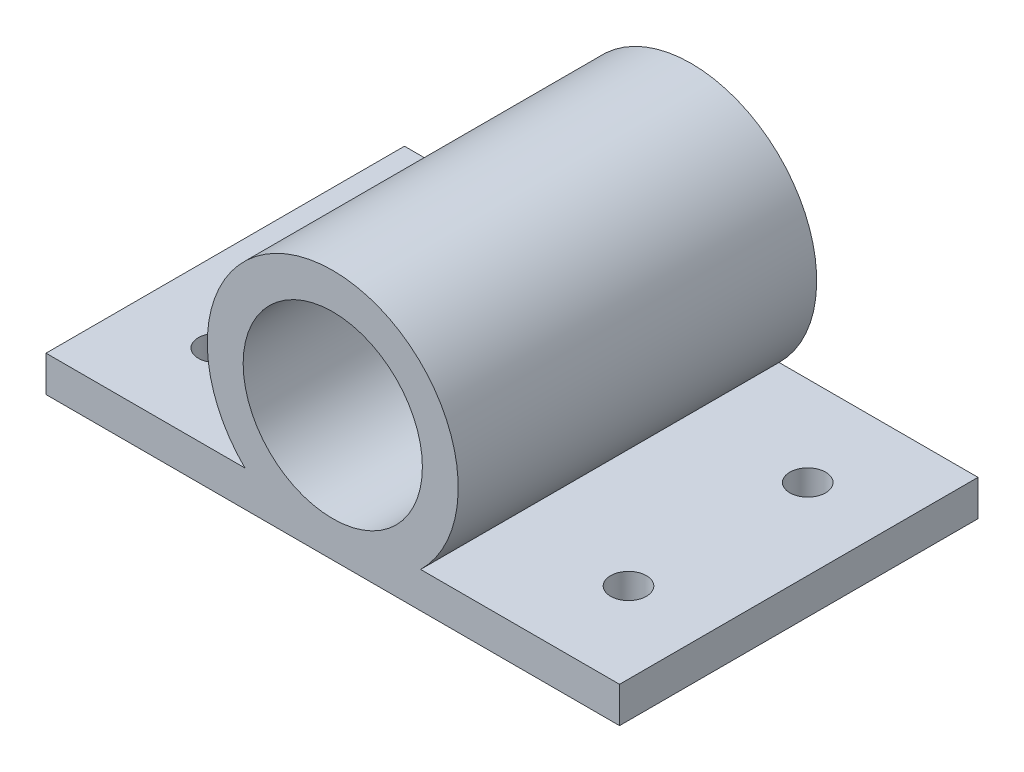
ISO-10303-21;
HEADER;
FILE_DESCRIPTION(('STEP AP214'),'2;1');
FILE_NAME('part.step','',(''),(''),'','','');
FILE_SCHEMA(('AUTOMOTIVE_DESIGN { 1 0 10303 214 1 1 1 1 }'));
ENDSEC;
DATA;
#1=APPLICATION_CONTEXT('core data for automotive mechanical design processes');
#2=APPLICATION_PROTOCOL_DEFINITION('international standard','automotive_design',2000,#1);
#3=PRODUCT_CONTEXT('',#1,'mechanical');
#4=PRODUCT('Part','Part','',(#3));
#5=PRODUCT_RELATED_PRODUCT_CATEGORY('part','',(#4));
#6=PRODUCT_DEFINITION_FORMATION('','',#4);
#7=PRODUCT_DEFINITION_CONTEXT('part definition',#1,'design');
#8=PRODUCT_DEFINITION('design','',#6,#7);
#9=PRODUCT_DEFINITION_SHAPE('','',#8);
#10=(LENGTH_UNIT() NAMED_UNIT(*) SI_UNIT(.MILLI.,.METRE.));
#11=(NAMED_UNIT(*) PLANE_ANGLE_UNIT() SI_UNIT($,.RADIAN.));
#12=(NAMED_UNIT(*) SI_UNIT($,.STERADIAN.) SOLID_ANGLE_UNIT());
#13=UNCERTAINTY_MEASURE_WITH_UNIT(LENGTH_MEASURE(1.E-05),#10,'distance_accuracy_value','');
#14=(GEOMETRIC_REPRESENTATION_CONTEXT(3) GLOBAL_UNCERTAINTY_ASSIGNED_CONTEXT((#13)) GLOBAL_UNIT_ASSIGNED_CONTEXT((#10,
#11,#12)) REPRESENTATION_CONTEXT('',''));
#15=CARTESIAN_POINT('',(0.,0.,0.));
#16=DIRECTION('',(0.,0.,1.));
#17=DIRECTION('',(1.,0.,0.));
#18=AXIS2_PLACEMENT_3D('',#15,#16,#17);
#19=CARTESIAN_POINT('',(0.,0.,100.));
#20=DIRECTION('',(0.,0.,-1.));
#21=DIRECTION('',(-1.,0.,0.));
#22=AXIS2_PLACEMENT_3D('',#19,#20,#21);
#23=PLANE('',#22);
#24=DIRECTION('',(0.,-1.,0.));
#25=VECTOR('',#24,1.);
#26=CARTESIAN_POINT('',(-80.,-35.,100.));
#27=LINE('',#26,#25);
#28=CARTESIAN_POINT('',(-80.,-25.,100.));
#29=VERTEX_POINT('',#28);
#30=CARTESIAN_POINT('',(-80.,-35.,100.));
#31=VERTEX_POINT('',#30);
#32=EDGE_CURVE('E146',#29,#31,#27,.T.);
#33=ORIENTED_EDGE('',*,*,#32,.T.);
#34=DIRECTION('',(1.,0.,0.));
#35=VECTOR('',#34,1.);
#36=CARTESIAN_POINT('',(-80.,-35.,100.));
#37=LINE('',#36,#35);
#38=CARTESIAN_POINT('',(80.,-35.,100.));
#39=VERTEX_POINT('',#38);
#40=EDGE_CURVE('E94',#31,#39,#37,.T.);
#41=ORIENTED_EDGE('',*,*,#40,.T.);
#42=DIRECTION('',(0.,1.,0.));
#43=VECTOR('',#42,1.);
#44=CARTESIAN_POINT('',(80.,-35.,100.));
#45=LINE('',#44,#43);
#46=CARTESIAN_POINT('',(80.,-25.,100.));
#47=VERTEX_POINT('',#46);
#48=EDGE_CURVE('E107',#39,#47,#45,.T.);
#49=ORIENTED_EDGE('',*,*,#48,.T.);
#50=DIRECTION('',(-1.,0.,0.));
#51=VECTOR('',#50,1.);
#52=CARTESIAN_POINT('',(24.4948974278318,-25.,100.));
#53=LINE('',#52,#51);
#54=CARTESIAN_POINT('',(24.4948974278318,-25.,100.));
#55=VERTEX_POINT('',#54);
#56=EDGE_CURVE('E101',#47,#55,#53,.T.);
#57=ORIENTED_EDGE('',*,*,#56,.T.);
#58=CARTESIAN_POINT('',(0.,0.,100.));
#59=DIRECTION('',(0.,0.,1.));
#60=DIRECTION('',(-1.,0.,0.));
#61=AXIS2_PLACEMENT_3D('',#58,#59,#60);
#62=CIRCLE('',#61,35.);
#63=CARTESIAN_POINT('',(-24.4948974278318,-25.,100.));
#64=VERTEX_POINT('',#63);
#65=EDGE_CURVE('E105',#55,#64,#62,.T.);
#66=ORIENTED_EDGE('',*,*,#65,.T.);
#67=DIRECTION('',(-1.,0.,0.));
#68=VECTOR('',#67,1.);
#69=CARTESIAN_POINT('',(-80.,-25.,100.));
#70=LINE('',#69,#68);
#71=EDGE_CURVE('E57',#64,#29,#70,.T.);
#72=ORIENTED_EDGE('',*,*,#71,.T.);
#73=EDGE_LOOP('',(#33,#41,#49,#57,#66,#72));
#74=FACE_BOUND('',#73,.T.);
#75=CARTESIAN_POINT('',(0.,0.,100.));
#76=DIRECTION('',(0.,0.,1.));
#77=DIRECTION('',(1.,0.,0.));
#78=AXIS2_PLACEMENT_3D('',#75,#76,#77);
#79=CIRCLE('',#78,25.);
#80=CARTESIAN_POINT('',(25.,0.,100.));
#81=VERTEX_POINT('',#80);
#82=EDGE_CURVE('E134',#81,#81,#79,.T.);
#83=ORIENTED_EDGE('',*,*,#82,.F.);
#84=EDGE_LOOP('',(#83));
#85=FACE_BOUND('',#84,.T.);
#86=ADVANCED_FACE('F39',(#74,#85),#23,.F.);
#87=CARTESIAN_POINT('',(0.,0.,0.));
#88=DIRECTION('',(0.,0.,-1.));
#89=DIRECTION('',(-1.,0.,0.));
#90=AXIS2_PLACEMENT_3D('',#87,#88,#89);
#91=PLANE('',#90);
#92=DIRECTION('',(0.,-1.,0.));
#93=VECTOR('',#92,1.);
#94=CARTESIAN_POINT('',(-80.,-35.,0.));
#95=LINE('',#94,#93);
#96=CARTESIAN_POINT('',(-80.,-25.,0.));
#97=VERTEX_POINT('',#96);
#98=CARTESIAN_POINT('',(-80.,-35.,0.));
#99=VERTEX_POINT('',#98);
#100=EDGE_CURVE('E129',#97,#99,#95,.T.);
#101=ORIENTED_EDGE('',*,*,#100,.F.);
#102=DIRECTION('',(-1.,0.,0.));
#103=VECTOR('',#102,1.);
#104=CARTESIAN_POINT('',(-80.,-25.,0.));
#105=LINE('',#104,#103);
#106=CARTESIAN_POINT('',(-24.4948974278318,-25.,0.));
#107=VERTEX_POINT('',#106);
#108=EDGE_CURVE('E86',#107,#97,#105,.T.);
#109=ORIENTED_EDGE('',*,*,#108,.F.);
#110=CARTESIAN_POINT('',(0.,0.,0.));
#111=DIRECTION('',(0.,0.,1.));
#112=DIRECTION('',(-1.,0.,0.));
#113=AXIS2_PLACEMENT_3D('',#110,#111,#112);
#114=CIRCLE('',#113,35.);
#115=CARTESIAN_POINT('',(24.4948974278318,-25.,0.));
#116=VERTEX_POINT('',#115);
#117=EDGE_CURVE('E80',#116,#107,#114,.T.);
#118=ORIENTED_EDGE('',*,*,#117,.F.);
#119=DIRECTION('',(-1.,0.,0.));
#120=VECTOR('',#119,1.);
#121=CARTESIAN_POINT('',(24.4948974278318,-25.,0.));
#122=LINE('',#121,#120);
#123=CARTESIAN_POINT('',(80.,-25.,0.));
#124=VERTEX_POINT('',#123);
#125=EDGE_CURVE('E116',#124,#116,#122,.T.);
#126=ORIENTED_EDGE('',*,*,#125,.F.);
#127=DIRECTION('',(0.,1.,0.));
#128=VECTOR('',#127,1.);
#129=CARTESIAN_POINT('',(80.,-35.,0.));
#130=LINE('',#129,#128);
#131=CARTESIAN_POINT('',(80.,-35.,0.));
#132=VERTEX_POINT('',#131);
#133=EDGE_CURVE('E137',#132,#124,#130,.T.);
#134=ORIENTED_EDGE('',*,*,#133,.F.);
#135=DIRECTION('',(1.,0.,0.));
#136=VECTOR('',#135,1.);
#137=CARTESIAN_POINT('',(-80.,-35.,0.));
#138=LINE('',#137,#136);
#139=EDGE_CURVE('E133',#99,#132,#138,.T.);
#140=ORIENTED_EDGE('',*,*,#139,.F.);
#141=EDGE_LOOP('',(#101,#109,#118,#126,#134,#140));
#142=FACE_BOUND('',#141,.T.);
#143=CARTESIAN_POINT('',(0.,0.,0.));
#144=DIRECTION('',(0.,0.,1.));
#145=DIRECTION('',(1.,0.,0.));
#146=AXIS2_PLACEMENT_3D('',#143,#144,#145);
#147=CIRCLE('',#146,25.);
#148=CARTESIAN_POINT('',(25.,0.,0.));
#149=VERTEX_POINT('',#148);
#150=EDGE_CURVE('E235',#149,#149,#147,.T.);
#151=ORIENTED_EDGE('',*,*,#150,.T.);
#152=EDGE_LOOP('',(#151));
#153=FACE_BOUND('',#152,.T.);
#154=ADVANCED_FACE('F159',(#142,#153),#91,.T.);
#155=CARTESIAN_POINT('',(-80.,-35.,100.));
#156=DIRECTION('',(1.,0.,0.));
#157=DIRECTION('',(0.,0.,-1.));
#158=AXIS2_PLACEMENT_3D('',#155,#156,#157);
#159=PLANE('',#158);
#160=ORIENTED_EDGE('',*,*,#100,.T.);
#161=DIRECTION('',(0.,0.,-1.));
#162=VECTOR('',#161,1.);
#163=CARTESIAN_POINT('',(-80.,-35.,100.));
#164=LINE('',#163,#162);
#165=EDGE_CURVE('E11',#31,#99,#164,.T.);
#166=ORIENTED_EDGE('',*,*,#165,.F.);
#167=ORIENTED_EDGE('',*,*,#32,.F.);
#168=DIRECTION('',(0.,0.,-1.));
#169=VECTOR('',#168,1.);
#170=CARTESIAN_POINT('',(-80.,-25.,100.));
#171=LINE('',#170,#169);
#172=EDGE_CURVE('E125',#29,#97,#171,.T.);
#173=ORIENTED_EDGE('',*,*,#172,.T.);
#174=EDGE_LOOP('',(#160,#166,#167,#173));
#175=FACE_BOUND('',#174,.T.);
#176=ADVANCED_FACE('F41',(#175),#159,.F.);
#177=CARTESIAN_POINT('',(-80.,-35.,100.));
#178=DIRECTION('',(0.,1.,0.));
#179=DIRECTION('',(-1.,0.,0.));
#180=AXIS2_PLACEMENT_3D('',#177,#178,#179);
#181=PLANE('',#180);
#182=CARTESIAN_POINT('',(57.5,-35.,75.));
#183=DIRECTION('',(0.,1.,0.));
#184=DIRECTION('',(-1.,0.,0.));
#185=AXIS2_PLACEMENT_3D('',#182,#183,#184);
#186=CIRCLE('',#185,5.00000000000001);
#187=CARTESIAN_POINT('',(52.5,-35.,75.));
#188=VERTEX_POINT('',#187);
#189=EDGE_CURVE('E215',#188,#188,#186,.T.);
#190=ORIENTED_EDGE('',*,*,#189,.T.);
#191=EDGE_LOOP('',(#190));
#192=FACE_BOUND('',#191,.T.);
#193=CARTESIAN_POINT('',(-57.5,-35.,25.));
#194=DIRECTION('',(0.,1.,0.));
#195=DIRECTION('',(-1.,0.,0.));
#196=AXIS2_PLACEMENT_3D('',#193,#194,#195);
#197=CIRCLE('',#196,5.);
#198=CARTESIAN_POINT('',(-62.5,-35.,25.));
#199=VERTEX_POINT('',#198);
#200=EDGE_CURVE('E224',#199,#199,#197,.T.);
#201=ORIENTED_EDGE('',*,*,#200,.T.);
#202=EDGE_LOOP('',(#201));
#203=FACE_BOUND('',#202,.T.);
#204=CARTESIAN_POINT('',(-57.5,-35.,75.));
#205=DIRECTION('',(0.,1.,0.));
#206=DIRECTION('',(-1.,0.,0.));
#207=AXIS2_PLACEMENT_3D('',#204,#205,#206);
#208=CIRCLE('',#207,5.);
#209=CARTESIAN_POINT('',(-62.5,-35.,75.));
#210=VERTEX_POINT('',#209);
#211=EDGE_CURVE('E205',#210,#210,#208,.T.);
#212=ORIENTED_EDGE('',*,*,#211,.T.);
#213=EDGE_LOOP('',(#212));
#214=FACE_BOUND('',#213,.T.);
#215=CARTESIAN_POINT('',(57.5,-35.,25.));
#216=DIRECTION('',(0.,1.,0.));
#217=DIRECTION('',(-1.,0.,0.));
#218=AXIS2_PLACEMENT_3D('',#215,#216,#217);
#219=CIRCLE('',#218,5.);
#220=CARTESIAN_POINT('',(52.5,-35.,25.));
#221=VERTEX_POINT('',#220);
#222=EDGE_CURVE('E231',#221,#221,#219,.T.);
#223=ORIENTED_EDGE('',*,*,#222,.T.);
#224=EDGE_LOOP('',(#223));
#225=FACE_BOUND('',#224,.T.);
#226=ORIENTED_EDGE('',*,*,#139,.T.);
#227=DIRECTION('',(0.,0.,-1.));
#228=VECTOR('',#227,1.);
#229=CARTESIAN_POINT('',(80.,-35.,100.));
#230=LINE('',#229,#228);
#231=EDGE_CURVE('E49',#39,#132,#230,.T.);
#232=ORIENTED_EDGE('',*,*,#231,.F.);
#233=ORIENTED_EDGE('',*,*,#40,.F.);
#234=ORIENTED_EDGE('',*,*,#165,.T.);
#235=EDGE_LOOP('',(#226,#232,#233,#234));
#236=FACE_BOUND('',#235,.T.);
#237=ADVANCED_FACE('F261',(#192,#203,#214,#225,#236),#181,.F.);
#238=CARTESIAN_POINT('',(80.,-35.,100.));
#239=DIRECTION('',(-1.,0.,0.));
#240=DIRECTION('',(0.,0.,1.));
#241=AXIS2_PLACEMENT_3D('',#238,#239,#240);
#242=PLANE('',#241);
#243=ORIENTED_EDGE('',*,*,#133,.T.);
#244=DIRECTION('',(0.,0.,-1.));
#245=VECTOR('',#244,1.);
#246=CARTESIAN_POINT('',(80.,-25.,100.));
#247=LINE('',#246,#245);
#248=EDGE_CURVE('E118',#47,#124,#247,.T.);
#249=ORIENTED_EDGE('',*,*,#248,.F.);
#250=ORIENTED_EDGE('',*,*,#48,.F.);
#251=ORIENTED_EDGE('',*,*,#231,.T.);
#252=EDGE_LOOP('',(#243,#249,#250,#251));
#253=FACE_BOUND('',#252,.T.);
#254=ADVANCED_FACE('F156',(#253),#242,.F.);
#255=CARTESIAN_POINT('',(24.4948974278318,-25.,100.));
#256=DIRECTION('',(0.,-1.,0.));
#257=DIRECTION('',(1.,0.,0.));
#258=AXIS2_PLACEMENT_3D('',#255,#256,#257);
#259=PLANE('',#258);
#260=CARTESIAN_POINT('',(57.5,-25.,75.));
#261=DIRECTION('',(0.,1.,0.));
#262=DIRECTION('',(-1.,0.,0.));
#263=AXIS2_PLACEMENT_3D('',#260,#261,#262);
#264=CIRCLE('',#263,5.00000000000001);
#265=CARTESIAN_POINT('',(52.5,-25.,75.));
#266=VERTEX_POINT('',#265);
#267=EDGE_CURVE('E220',#266,#266,#264,.T.);
#268=ORIENTED_EDGE('',*,*,#267,.F.);
#269=EDGE_LOOP('',(#268));
#270=FACE_BOUND('',#269,.T.);
#271=CARTESIAN_POINT('',(57.5,-25.,25.));
#272=DIRECTION('',(0.,1.,0.));
#273=DIRECTION('',(-1.,0.,0.));
#274=AXIS2_PLACEMENT_3D('',#271,#272,#273);
#275=CIRCLE('',#274,5.);
#276=CARTESIAN_POINT('',(52.5,-25.,25.));
#277=VERTEX_POINT('',#276);
#278=EDGE_CURVE('E219',#277,#277,#275,.T.);
#279=ORIENTED_EDGE('',*,*,#278,.F.);
#280=EDGE_LOOP('',(#279));
#281=FACE_BOUND('',#280,.T.);
#282=ORIENTED_EDGE('',*,*,#125,.T.);
#283=DIRECTION('',(0.,0.,-1.));
#284=VECTOR('',#283,1.);
#285=CARTESIAN_POINT('',(24.4948974278318,-25.,100.));
#286=LINE('',#285,#284);
#287=EDGE_CURVE('E113',#55,#116,#286,.T.);
#288=ORIENTED_EDGE('',*,*,#287,.F.);
#289=ORIENTED_EDGE('',*,*,#56,.F.);
#290=ORIENTED_EDGE('',*,*,#248,.T.);
#291=EDGE_LOOP('',(#282,#288,#289,#290));
#292=FACE_BOUND('',#291,.T.);
#293=ADVANCED_FACE('F114',(#270,#281,#292),#259,.F.);
#294=CARTESIAN_POINT('',(0.,0.,100.));
#295=DIRECTION('',(0.,0.,-1.));
#296=DIRECTION('',(-1.,0.,0.));
#297=AXIS2_PLACEMENT_3D('',#294,#295,#296);
#298=CYLINDRICAL_SURFACE('',#297,35.);
#299=ORIENTED_EDGE('',*,*,#117,.T.);
#300=DIRECTION('',(0.,0.,-1.));
#301=VECTOR('',#300,1.);
#302=CARTESIAN_POINT('',(-24.4948974278318,-25.,100.));
#303=LINE('',#302,#301);
#304=EDGE_CURVE('E119',#64,#107,#303,.T.);
#305=ORIENTED_EDGE('',*,*,#304,.F.);
#306=ORIENTED_EDGE('',*,*,#65,.F.);
#307=ORIENTED_EDGE('',*,*,#287,.T.);
#308=EDGE_LOOP('',(#299,#305,#306,#307));
#309=FACE_BOUND('',#308,.T.);
#310=ADVANCED_FACE('F121',(#309),#298,.T.);
#311=CARTESIAN_POINT('',(-80.,-25.,100.));
#312=DIRECTION('',(0.,-1.,0.));
#313=DIRECTION('',(1.,0.,0.));
#314=AXIS2_PLACEMENT_3D('',#311,#312,#313);
#315=PLANE('',#314);
#316=CARTESIAN_POINT('',(-57.5,-25.,25.));
#317=DIRECTION('',(0.,1.,0.));
#318=DIRECTION('',(-1.,0.,0.));
#319=AXIS2_PLACEMENT_3D('',#316,#317,#318);
#320=CIRCLE('',#319,5.);
#321=CARTESIAN_POINT('',(-62.5,-25.,25.));
#322=VERTEX_POINT('',#321);
#323=EDGE_CURVE('E212',#322,#322,#320,.T.);
#324=ORIENTED_EDGE('',*,*,#323,.F.);
#325=EDGE_LOOP('',(#324));
#326=FACE_BOUND('',#325,.T.);
#327=CARTESIAN_POINT('',(-57.5,-25.,75.));
#328=DIRECTION('',(0.,1.,0.));
#329=DIRECTION('',(-1.,0.,0.));
#330=AXIS2_PLACEMENT_3D('',#327,#328,#329);
#331=CIRCLE('',#330,5.);
#332=CARTESIAN_POINT('',(-62.5,-25.,75.));
#333=VERTEX_POINT('',#332);
#334=EDGE_CURVE('E208',#333,#333,#331,.T.);
#335=ORIENTED_EDGE('',*,*,#334,.F.);
#336=EDGE_LOOP('',(#335));
#337=FACE_BOUND('',#336,.T.);
#338=ORIENTED_EDGE('',*,*,#108,.T.);
#339=ORIENTED_EDGE('',*,*,#172,.F.);
#340=ORIENTED_EDGE('',*,*,#71,.F.);
#341=ORIENTED_EDGE('',*,*,#304,.T.);
#342=EDGE_LOOP('',(#338,#339,#340,#341));
#343=FACE_BOUND('',#342,.T.);
#344=ADVANCED_FACE('F164',(#326,#337,#343),#315,.F.);
#345=CARTESIAN_POINT('',(0.,0.,100.));
#346=DIRECTION('',(0.,0.,-1.));
#347=DIRECTION('',(-1.,0.,0.));
#348=AXIS2_PLACEMENT_3D('',#345,#346,#347);
#349=CYLINDRICAL_SURFACE('',#348,25.);
#350=ORIENTED_EDGE('',*,*,#82,.T.);
#351=EDGE_LOOP('',(#350));
#352=FACE_BOUND('',#351,.T.);
#353=ORIENTED_EDGE('',*,*,#150,.F.);
#354=EDGE_LOOP('',(#353));
#355=FACE_BOUND('',#354,.T.);
#356=ADVANCED_FACE('F166',(#352,#355),#349,.F.);
#357=CARTESIAN_POINT('',(-57.5,-35.,75.));
#358=DIRECTION('',(0.,1.,0.));
#359=DIRECTION('',(-1.,0.,0.));
#360=AXIS2_PLACEMENT_3D('',#357,#358,#359);
#361=CYLINDRICAL_SURFACE('',#360,5.);
#362=ORIENTED_EDGE('',*,*,#211,.F.);
#363=EDGE_LOOP('',(#362));
#364=FACE_BOUND('',#363,.T.);
#365=ORIENTED_EDGE('',*,*,#334,.T.);
#366=EDGE_LOOP('',(#365));
#367=FACE_BOUND('',#366,.T.);
#368=ADVANCED_FACE('F173',(#364,#367),#361,.F.);
#369=CARTESIAN_POINT('',(-57.5,-35.,25.));
#370=DIRECTION('',(0.,1.,0.));
#371=DIRECTION('',(-1.,0.,0.));
#372=AXIS2_PLACEMENT_3D('',#369,#370,#371);
#373=CYLINDRICAL_SURFACE('',#372,5.);
#374=ORIENTED_EDGE('',*,*,#200,.F.);
#375=EDGE_LOOP('',(#374));
#376=FACE_BOUND('',#375,.T.);
#377=ORIENTED_EDGE('',*,*,#323,.T.);
#378=EDGE_LOOP('',(#377));
#379=FACE_BOUND('',#378,.T.);
#380=ADVANCED_FACE('F190',(#376,#379),#373,.F.);
#381=CARTESIAN_POINT('',(57.5,-35.,25.));
#382=DIRECTION('',(0.,1.,0.));
#383=DIRECTION('',(-1.,0.,0.));
#384=AXIS2_PLACEMENT_3D('',#381,#382,#383);
#385=CYLINDRICAL_SURFACE('',#384,5.);
#386=ORIENTED_EDGE('',*,*,#222,.F.);
#387=EDGE_LOOP('',(#386));
#388=FACE_BOUND('',#387,.T.);
#389=ORIENTED_EDGE('',*,*,#278,.T.);
#390=EDGE_LOOP('',(#389));
#391=FACE_BOUND('',#390,.T.);
#392=ADVANCED_FACE('F186',(#388,#391),#385,.F.);
#393=CARTESIAN_POINT('',(57.5,-35.,75.));
#394=DIRECTION('',(0.,1.,0.));
#395=DIRECTION('',(-1.,0.,0.));
#396=AXIS2_PLACEMENT_3D('',#393,#394,#395);
#397=CYLINDRICAL_SURFACE('',#396,5.00000000000001);
#398=ORIENTED_EDGE('',*,*,#189,.F.);
#399=EDGE_LOOP('',(#398));
#400=FACE_BOUND('',#399,.T.);
#401=ORIENTED_EDGE('',*,*,#267,.T.);
#402=EDGE_LOOP('',(#401));
#403=FACE_BOUND('',#402,.T.);
#404=ADVANCED_FACE('F189',(#400,#403),#397,.F.);
#405=CLOSED_SHELL('',(#86,#154,#176,#237,#254,#293,#310,#344,#356,#368,#380,#392,#404));
#406=MANIFOLD_SOLID_BREP('B2',#405);
#407=ADVANCED_BREP_SHAPE_REPRESENTATION('',(#18,#406),#14);
#408=SHAPE_DEFINITION_REPRESENTATION(#9,#407);
ENDSEC;
END-ISO-10303-21;
